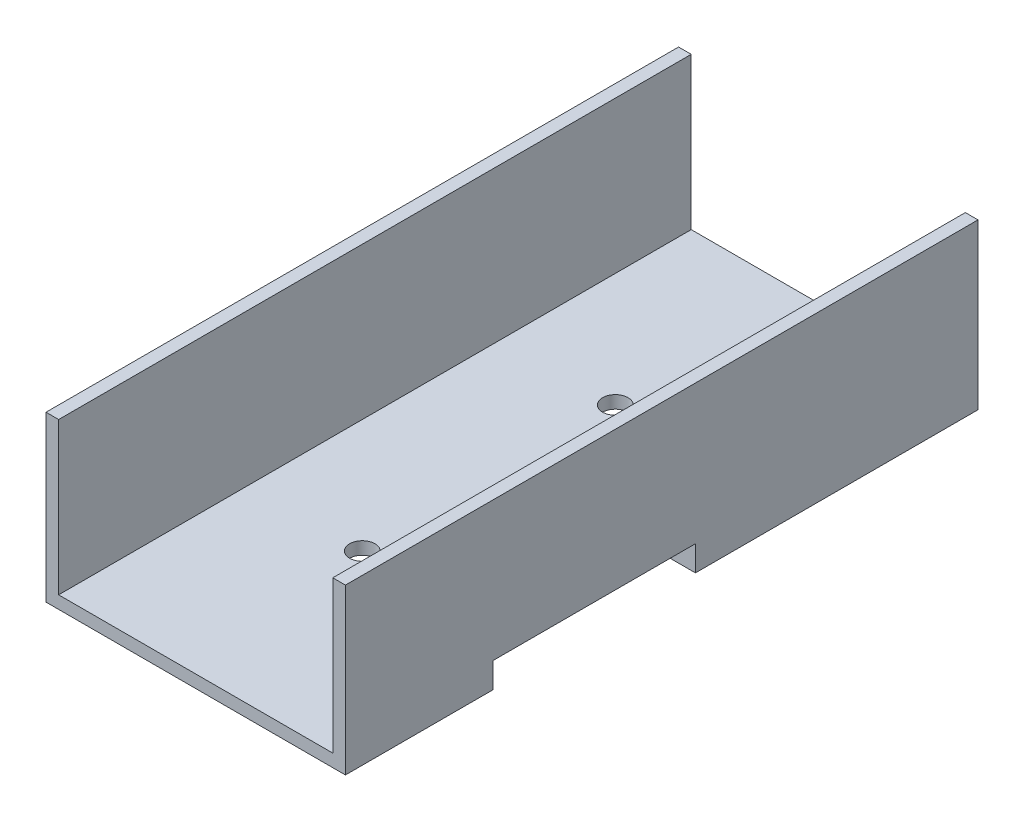
ISO-10303-21;
HEADER;
FILE_DESCRIPTION(('STEP AP214'),'2;1');
FILE_NAME('part.step','',(''),(''),'','','');
FILE_SCHEMA(('AUTOMOTIVE_DESIGN { 1 0 10303 214 1 1 1 1 }'));
ENDSEC;
DATA;
#1=APPLICATION_CONTEXT('core data for automotive mechanical design processes');
#2=APPLICATION_PROTOCOL_DEFINITION('international standard','automotive_design',2000,#1);
#3=PRODUCT_CONTEXT('',#1,'mechanical');
#4=PRODUCT('Part','Part','',(#3));
#5=PRODUCT_RELATED_PRODUCT_CATEGORY('part','',(#4));
#6=PRODUCT_DEFINITION_FORMATION('','',#4);
#7=PRODUCT_DEFINITION_CONTEXT('part definition',#1,'design');
#8=PRODUCT_DEFINITION('design','',#6,#7);
#9=PRODUCT_DEFINITION_SHAPE('','',#8);
#10=(LENGTH_UNIT() NAMED_UNIT(*) SI_UNIT(.MILLI.,.METRE.));
#11=(NAMED_UNIT(*) PLANE_ANGLE_UNIT() SI_UNIT($,.RADIAN.));
#12=(NAMED_UNIT(*) SI_UNIT($,.STERADIAN.) SOLID_ANGLE_UNIT());
#13=UNCERTAINTY_MEASURE_WITH_UNIT(LENGTH_MEASURE(1.E-05),#10,'distance_accuracy_value','');
#14=(GEOMETRIC_REPRESENTATION_CONTEXT(3) GLOBAL_UNCERTAINTY_ASSIGNED_CONTEXT((#13)) GLOBAL_UNIT_ASSIGNED_CONTEXT((#10,
#11,#12)) REPRESENTATION_CONTEXT('',''));
#15=CARTESIAN_POINT('',(0.,0.,0.));
#16=DIRECTION('',(0.,0.,1.));
#17=DIRECTION('',(1.,0.,0.));
#18=AXIS2_PLACEMENT_3D('',#15,#16,#17);
#19=CARTESIAN_POINT('',(17.75,0.,37.5));
#20=DIRECTION('',(-1.,0.,0.));
#21=DIRECTION('',(0.,0.,1.));
#22=AXIS2_PLACEMENT_3D('',#19,#20,#21);
#23=PLANE('',#22);
#24=DIRECTION('',(0.,0.,1.));
#25=VECTOR('',#24,1.);
#26=CARTESIAN_POINT('',(17.75,3.,20.));
#27=LINE('',#26,#25);
#28=CARTESIAN_POINT('',(17.75,3.,-4.));
#29=VERTEX_POINT('',#28);
#30=CARTESIAN_POINT('',(17.75,3.,20.));
#31=VERTEX_POINT('',#30);
#32=EDGE_CURVE('E150',#29,#31,#27,.T.);
#33=ORIENTED_EDGE('',*,*,#32,.F.);
#34=DIRECTION('',(0.,-1.,0.));
#35=VECTOR('',#34,1.);
#36=CARTESIAN_POINT('',(17.75,3.,-4.));
#37=LINE('',#36,#35);
#38=CARTESIAN_POINT('',(17.75,0.,-4.));
#39=VERTEX_POINT('',#38);
#40=EDGE_CURVE('E181',#29,#39,#37,.T.);
#41=ORIENTED_EDGE('',*,*,#40,.T.);
#42=DIRECTION('',(0.,0.,-1.));
#43=VECTOR('',#42,1.);
#44=CARTESIAN_POINT('',(17.75,0.,37.5));
#45=LINE('',#44,#43);
#46=CARTESIAN_POINT('',(17.75,0.,-37.5));
#47=VERTEX_POINT('',#46);
#48=EDGE_CURVE('E220',#39,#47,#45,.T.);
#49=ORIENTED_EDGE('',*,*,#48,.T.);
#50=DIRECTION('',(0.,1.,0.));
#51=VECTOR('',#50,1.);
#52=CARTESIAN_POINT('',(17.75,0.,-37.5));
#53=LINE('',#52,#51);
#54=CARTESIAN_POINT('',(17.75,19.5,-37.5));
#55=VERTEX_POINT('',#54);
#56=EDGE_CURVE('E197',#47,#55,#53,.T.);
#57=ORIENTED_EDGE('',*,*,#56,.T.);
#58=DIRECTION('',(0.,0.,-1.));
#59=VECTOR('',#58,1.);
#60=CARTESIAN_POINT('',(17.75,19.5,37.5));
#61=LINE('',#60,#59);
#62=CARTESIAN_POINT('',(17.75,19.5,37.5));
#63=VERTEX_POINT('',#62);
#64=EDGE_CURVE('E41',#63,#55,#61,.T.);
#65=ORIENTED_EDGE('',*,*,#64,.F.);
#66=DIRECTION('',(0.,1.,0.));
#67=VECTOR('',#66,1.);
#68=CARTESIAN_POINT('',(17.75,0.,37.5));
#69=LINE('',#68,#67);
#70=CARTESIAN_POINT('',(17.75,0.,37.5));
#71=VERTEX_POINT('',#70);
#72=EDGE_CURVE('E198',#71,#63,#69,.T.);
#73=ORIENTED_EDGE('',*,*,#72,.F.);
#74=CARTESIAN_POINT('',(17.75,0.,20.));
#75=VERTEX_POINT('',#74);
#76=EDGE_CURVE('E163',#71,#75,#45,.T.);
#77=ORIENTED_EDGE('',*,*,#76,.T.);
#78=DIRECTION('',(0.,-1.,0.));
#79=VECTOR('',#78,1.);
#80=CARTESIAN_POINT('',(17.75,3.,20.));
#81=LINE('',#80,#79);
#82=EDGE_CURVE('E54',#31,#75,#81,.T.);
#83=ORIENTED_EDGE('',*,*,#82,.F.);
#84=EDGE_LOOP('',(#33,#41,#49,#57,#65,#73,#77,#83));
#85=FACE_BOUND('',#84,.T.);
#86=ADVANCED_FACE('F34',(#85),#23,.F.);
#87=CARTESIAN_POINT('',(16.25,19.5,37.5));
#88=DIRECTION('',(0.,1.,0.));
#89=DIRECTION('',(0.,0.,1.));
#90=AXIS2_PLACEMENT_3D('',#87,#88,#89);
#91=PLANE('',#90);
#92=DIRECTION('',(1.,0.,0.));
#93=VECTOR('',#92,1.);
#94=CARTESIAN_POINT('',(16.25,19.5,-37.5));
#95=LINE('',#94,#93);
#96=CARTESIAN_POINT('',(16.25,19.5,-37.5));
#97=VERTEX_POINT('',#96);
#98=EDGE_CURVE('E223',#97,#55,#95,.T.);
#99=ORIENTED_EDGE('',*,*,#98,.F.);
#100=DIRECTION('',(0.,0.,-1.));
#101=VECTOR('',#100,1.);
#102=CARTESIAN_POINT('',(16.25,19.5,37.5));
#103=LINE('',#102,#101);
#104=CARTESIAN_POINT('',(16.25,19.5,37.5));
#105=VERTEX_POINT('',#104);
#106=EDGE_CURVE('E256',#105,#97,#103,.T.);
#107=ORIENTED_EDGE('',*,*,#106,.F.);
#108=DIRECTION('',(1.,0.,0.));
#109=VECTOR('',#108,1.);
#110=CARTESIAN_POINT('',(16.25,19.5,37.5));
#111=LINE('',#110,#109);
#112=EDGE_CURVE('E200',#105,#63,#111,.T.);
#113=ORIENTED_EDGE('',*,*,#112,.T.);
#114=ORIENTED_EDGE('',*,*,#64,.T.);
#115=EDGE_LOOP('',(#99,#107,#113,#114));
#116=FACE_BOUND('',#115,.T.);
#117=ADVANCED_FACE('F260',(#116),#91,.T.);
#118=CARTESIAN_POINT('',(16.25,0.,37.5));
#119=DIRECTION('',(-1.,0.,0.));
#120=DIRECTION('',(0.,0.,1.));
#121=AXIS2_PLACEMENT_3D('',#118,#119,#120);
#122=PLANE('',#121);
#123=DIRECTION('',(0.,-1.,0.));
#124=VECTOR('',#123,1.);
#125=CARTESIAN_POINT('',(16.25,0.,-4.));
#126=LINE('',#125,#124);
#127=CARTESIAN_POINT('',(16.25,3.,-4.));
#128=VERTEX_POINT('',#127);
#129=CARTESIAN_POINT('',(16.25,1.5,-4.));
#130=VERTEX_POINT('',#129);
#131=EDGE_CURVE('E195',#128,#130,#126,.T.);
#132=ORIENTED_EDGE('',*,*,#131,.F.);
#133=DIRECTION('',(0.,0.,1.));
#134=VECTOR('',#133,1.);
#135=CARTESIAN_POINT('',(16.25,3.,37.5));
#136=LINE('',#135,#134);
#137=CARTESIAN_POINT('',(16.25,3.,20.));
#138=VERTEX_POINT('',#137);
#139=EDGE_CURVE('E11',#128,#138,#136,.T.);
#140=ORIENTED_EDGE('',*,*,#139,.T.);
#141=DIRECTION('',(0.,1.,0.));
#142=VECTOR('',#141,1.);
#143=CARTESIAN_POINT('',(16.25,0.,20.));
#144=LINE('',#143,#142);
#145=CARTESIAN_POINT('',(16.25,1.5,20.));
#146=VERTEX_POINT('',#145);
#147=EDGE_CURVE('E147',#146,#138,#144,.T.);
#148=ORIENTED_EDGE('',*,*,#147,.F.);
#149=DIRECTION('',(0.,0.,-1.));
#150=VECTOR('',#149,1.);
#151=CARTESIAN_POINT('',(16.25,1.5,37.5));
#152=LINE('',#151,#150);
#153=CARTESIAN_POINT('',(16.25,1.5,37.5));
#154=VERTEX_POINT('',#153);
#155=EDGE_CURVE('E253',#154,#146,#152,.T.);
#156=ORIENTED_EDGE('',*,*,#155,.F.);
#157=DIRECTION('',(0.,1.,0.));
#158=VECTOR('',#157,1.);
#159=CARTESIAN_POINT('',(16.25,0.,37.5));
#160=LINE('',#159,#158);
#161=EDGE_CURVE('E204',#154,#105,#160,.T.);
#162=ORIENTED_EDGE('',*,*,#161,.T.);
#163=ORIENTED_EDGE('',*,*,#106,.T.);
#164=DIRECTION('',(0.,1.,0.));
#165=VECTOR('',#164,1.);
#166=CARTESIAN_POINT('',(16.25,0.,-37.5));
#167=LINE('',#166,#165);
#168=CARTESIAN_POINT('',(16.25,1.5,-37.5));
#169=VERTEX_POINT('',#168);
#170=EDGE_CURVE('E226',#169,#97,#167,.T.);
#171=ORIENTED_EDGE('',*,*,#170,.F.);
#172=EDGE_CURVE('E252',#130,#169,#152,.T.);
#173=ORIENTED_EDGE('',*,*,#172,.F.);
#174=EDGE_LOOP('',(#132,#140,#148,#156,#162,#163,#171,#173));
#175=FACE_BOUND('',#174,.T.);
#176=ADVANCED_FACE('F272',(#175),#122,.T.);
#177=CARTESIAN_POINT('',(-17.75,1.5,37.5));
#178=DIRECTION('',(0.,1.,0.));
#179=DIRECTION('',(0.,0.,1.));
#180=AXIS2_PLACEMENT_3D('',#177,#178,#179);
#181=PLANE('',#180);
#182=DIRECTION('',(-1.,0.,0.));
#183=VECTOR('',#182,1.);
#184=CARTESIAN_POINT('',(-17.75,1.5,-4.));
#185=LINE('',#184,#183);
#186=CARTESIAN_POINT('',(11.75,1.5,-4.));
#187=VERTEX_POINT('',#186);
#188=EDGE_CURVE('E193',#130,#187,#185,.T.);
#189=ORIENTED_EDGE('',*,*,#188,.F.);
#190=ORIENTED_EDGE('',*,*,#172,.T.);
#191=DIRECTION('',(1.,0.,0.));
#192=VECTOR('',#191,1.);
#193=CARTESIAN_POINT('',(-17.75,1.5,-37.5));
#194=LINE('',#193,#192);
#195=CARTESIAN_POINT('',(-16.25,1.5,-37.5));
#196=VERTEX_POINT('',#195);
#197=EDGE_CURVE('E229',#196,#169,#194,.T.);
#198=ORIENTED_EDGE('',*,*,#197,.F.);
#199=DIRECTION('',(0.,0.,-1.));
#200=VECTOR('',#199,1.);
#201=CARTESIAN_POINT('',(-16.25,1.5,37.5));
#202=LINE('',#201,#200);
#203=CARTESIAN_POINT('',(-16.25,1.5,37.5));
#204=VERTEX_POINT('',#203);
#205=EDGE_CURVE('E250',#204,#196,#202,.T.);
#206=ORIENTED_EDGE('',*,*,#205,.F.);
#207=DIRECTION('',(1.,0.,0.));
#208=VECTOR('',#207,1.);
#209=CARTESIAN_POINT('',(-17.75,1.5,37.5));
#210=LINE('',#209,#208);
#211=EDGE_CURVE('E207',#204,#154,#210,.T.);
#212=ORIENTED_EDGE('',*,*,#211,.T.);
#213=ORIENTED_EDGE('',*,*,#155,.T.);
#214=DIRECTION('',(1.,0.,0.));
#215=VECTOR('',#214,1.);
#216=CARTESIAN_POINT('',(-17.75,1.5,20.));
#217=LINE('',#216,#215);
#218=CARTESIAN_POINT('',(11.75,1.5,20.));
#219=VERTEX_POINT('',#218);
#220=EDGE_CURVE('E184',#219,#146,#217,.T.);
#221=ORIENTED_EDGE('',*,*,#220,.F.);
#222=CARTESIAN_POINT('',(11.75,1.5,16.));
#223=DIRECTION('',(0.,1.,0.));
#224=DIRECTION('',(0.,0.,1.));
#225=AXIS2_PLACEMENT_3D('',#222,#223,#224);
#226=CIRCLE('',#225,4.);
#227=CARTESIAN_POINT('',(7.75,1.5,16.));
#228=VERTEX_POINT('',#227);
#229=EDGE_CURVE('E187',#228,#219,#226,.T.);
#230=ORIENTED_EDGE('',*,*,#229,.F.);
#231=DIRECTION('',(0.,0.,1.));
#232=VECTOR('',#231,1.);
#233=CARTESIAN_POINT('',(7.74999999999999,1.5,37.5));
#234=LINE('',#233,#232);
#235=CARTESIAN_POINT('',(7.75,1.5,0.));
#236=VERTEX_POINT('',#235);
#237=EDGE_CURVE('E189',#236,#228,#234,.T.);
#238=ORIENTED_EDGE('',*,*,#237,.F.);
#239=CARTESIAN_POINT('',(11.75,1.5,0.));
#240=DIRECTION('',(0.,1.,0.));
#241=DIRECTION('',(0.,0.,1.));
#242=AXIS2_PLACEMENT_3D('',#239,#240,#241);
#243=CIRCLE('',#242,4.);
#244=EDGE_CURVE('E191',#187,#236,#243,.T.);
#245=ORIENTED_EDGE('',*,*,#244,.F.);
#246=EDGE_LOOP('',(#189,#190,#198,#206,#212,#213,#221,#230,#238,#245));
#247=FACE_BOUND('',#246,.T.);
#248=CARTESIAN_POINT('',(-2.75,1.5,-15.));
#249=DIRECTION('',(0.,1.,0.));
#250=DIRECTION('',(0.,0.,1.));
#251=AXIS2_PLACEMENT_3D('',#248,#249,#250);
#252=CIRCLE('',#251,1.5);
#253=CARTESIAN_POINT('',(-2.75,1.5,-13.5));
#254=VERTEX_POINT('',#253);
#255=EDGE_CURVE('E180',#254,#254,#252,.T.);
#256=ORIENTED_EDGE('',*,*,#255,.F.);
#257=EDGE_LOOP('',(#256));
#258=FACE_BOUND('',#257,.T.);
#259=CARTESIAN_POINT('',(-2.75,1.5,15.));
#260=DIRECTION('',(0.,1.,0.));
#261=DIRECTION('',(0.,0.,1.));
#262=AXIS2_PLACEMENT_3D('',#259,#260,#261);
#263=CIRCLE('',#262,1.5);
#264=CARTESIAN_POINT('',(-2.75,1.5,16.5));
#265=VERTEX_POINT('',#264);
#266=EDGE_CURVE('E177',#265,#265,#263,.T.);
#267=ORIENTED_EDGE('',*,*,#266,.F.);
#268=EDGE_LOOP('',(#267));
#269=FACE_BOUND('',#268,.T.);
#270=ADVANCED_FACE('F317',(#247,#258,#269),#181,.T.);
#271=CARTESIAN_POINT('',(-16.25,19.5,37.5));
#272=DIRECTION('',(1.,0.,0.));
#273=DIRECTION('',(0.,0.,-1.));
#274=AXIS2_PLACEMENT_3D('',#271,#272,#273);
#275=PLANE('',#274);
#276=DIRECTION('',(0.,1.,0.));
#277=VECTOR('',#276,1.);
#278=CARTESIAN_POINT('',(-16.25,19.5,-37.5));
#279=LINE('',#278,#277);
#280=CARTESIAN_POINT('',(-16.25,19.5,-37.5));
#281=VERTEX_POINT('',#280);
#282=EDGE_CURVE('E232',#281,#196,#279,.F.);
#283=ORIENTED_EDGE('',*,*,#282,.F.);
#284=DIRECTION('',(0.,0.,-1.));
#285=VECTOR('',#284,1.);
#286=CARTESIAN_POINT('',(-16.25,19.5,37.5));
#287=LINE('',#286,#285);
#288=CARTESIAN_POINT('',(-16.25,19.5,37.5));
#289=VERTEX_POINT('',#288);
#290=EDGE_CURVE('E248',#289,#281,#287,.T.);
#291=ORIENTED_EDGE('',*,*,#290,.F.);
#292=DIRECTION('',(0.,1.,0.));
#293=VECTOR('',#292,1.);
#294=CARTESIAN_POINT('',(-16.25,19.5,37.5));
#295=LINE('',#294,#293);
#296=EDGE_CURVE('E210',#289,#204,#295,.F.);
#297=ORIENTED_EDGE('',*,*,#296,.T.);
#298=ORIENTED_EDGE('',*,*,#205,.T.);
#299=EDGE_LOOP('',(#283,#291,#297,#298));
#300=FACE_BOUND('',#299,.T.);
#301=ADVANCED_FACE('F330',(#300),#275,.T.);
#302=CARTESIAN_POINT('',(-17.75,19.5,37.5));
#303=DIRECTION('',(0.,1.,0.));
#304=DIRECTION('',(0.,0.,1.));
#305=AXIS2_PLACEMENT_3D('',#302,#303,#304);
#306=PLANE('',#305);
#307=DIRECTION('',(1.,0.,0.));
#308=VECTOR('',#307,1.);
#309=CARTESIAN_POINT('',(-17.75,19.5,-37.5));
#310=LINE('',#309,#308);
#311=CARTESIAN_POINT('',(-17.75,19.5,-37.5));
#312=VERTEX_POINT('',#311);
#313=EDGE_CURVE('E235',#312,#281,#310,.T.);
#314=ORIENTED_EDGE('',*,*,#313,.F.);
#315=DIRECTION('',(0.,0.,-1.));
#316=VECTOR('',#315,1.);
#317=CARTESIAN_POINT('',(-17.75,19.5,37.5));
#318=LINE('',#317,#316);
#319=CARTESIAN_POINT('',(-17.75,19.5,37.5));
#320=VERTEX_POINT('',#319);
#321=EDGE_CURVE('E246',#320,#312,#318,.T.);
#322=ORIENTED_EDGE('',*,*,#321,.F.);
#323=DIRECTION('',(1.,0.,0.));
#324=VECTOR('',#323,1.);
#325=CARTESIAN_POINT('',(-17.75,19.5,37.5));
#326=LINE('',#325,#324);
#327=EDGE_CURVE('E213',#320,#289,#326,.T.);
#328=ORIENTED_EDGE('',*,*,#327,.T.);
#329=ORIENTED_EDGE('',*,*,#290,.T.);
#330=EDGE_LOOP('',(#314,#322,#328,#329));
#331=FACE_BOUND('',#330,.T.);
#332=ADVANCED_FACE('F326',(#331),#306,.T.);
#333=CARTESIAN_POINT('',(-17.75,19.5,37.5));
#334=DIRECTION('',(1.,0.,0.));
#335=DIRECTION('',(0.,0.,-1.));
#336=AXIS2_PLACEMENT_3D('',#333,#334,#335);
#337=PLANE('',#336);
#338=DIRECTION('',(0.,-1.,0.));
#339=VECTOR('',#338,1.);
#340=CARTESIAN_POINT('',(-17.75,19.5,-37.5));
#341=LINE('',#340,#339);
#342=CARTESIAN_POINT('',(-17.75,0.,-37.5));
#343=VERTEX_POINT('',#342);
#344=EDGE_CURVE('E238',#312,#343,#341,.T.);
#345=ORIENTED_EDGE('',*,*,#344,.T.);
#346=DIRECTION('',(0.,0.,-1.));
#347=VECTOR('',#346,1.);
#348=CARTESIAN_POINT('',(-17.75,0.,37.5));
#349=LINE('',#348,#347);
#350=CARTESIAN_POINT('',(-17.75,0.,37.5));
#351=VERTEX_POINT('',#350);
#352=EDGE_CURVE('E243',#351,#343,#349,.T.);
#353=ORIENTED_EDGE('',*,*,#352,.F.);
#354=DIRECTION('',(0.,-1.,0.));
#355=VECTOR('',#354,1.);
#356=CARTESIAN_POINT('',(-17.75,19.5,37.5));
#357=LINE('',#356,#355);
#358=EDGE_CURVE('E216',#320,#351,#357,.T.);
#359=ORIENTED_EDGE('',*,*,#358,.F.);
#360=ORIENTED_EDGE('',*,*,#321,.T.);
#361=EDGE_LOOP('',(#345,#353,#359,#360));
#362=FACE_BOUND('',#361,.T.);
#363=ADVANCED_FACE('F337',(#362),#337,.F.);
#364=CARTESIAN_POINT('',(-17.75,0.,37.5));
#365=DIRECTION('',(0.,1.,0.));
#366=DIRECTION('',(0.,0.,1.));
#367=AXIS2_PLACEMENT_3D('',#364,#365,#366);
#368=PLANE('',#367);
#369=CARTESIAN_POINT('',(-2.75,0.,-15.));
#370=DIRECTION('',(0.,-1.,0.));
#371=DIRECTION('',(0.,0.,1.));
#372=AXIS2_PLACEMENT_3D('',#369,#370,#371);
#373=CIRCLE('',#372,1.5);
#374=CARTESIAN_POINT('',(-2.75,0.,-13.5));
#375=VERTEX_POINT('',#374);
#376=EDGE_CURVE('E170',#375,#375,#373,.T.);
#377=ORIENTED_EDGE('',*,*,#376,.F.);
#378=EDGE_LOOP('',(#377));
#379=FACE_BOUND('',#378,.T.);
#380=CARTESIAN_POINT('',(-2.75,0.,15.));
#381=DIRECTION('',(0.,-1.,0.));
#382=DIRECTION('',(0.,0.,-1.));
#383=AXIS2_PLACEMENT_3D('',#380,#381,#382);
#384=CIRCLE('',#383,1.5);
#385=CARTESIAN_POINT('',(-2.75,0.,13.5));
#386=VERTEX_POINT('',#385);
#387=EDGE_CURVE('E174',#386,#386,#384,.T.);
#388=ORIENTED_EDGE('',*,*,#387,.F.);
#389=EDGE_LOOP('',(#388));
#390=FACE_BOUND('',#389,.T.);
#391=ORIENTED_EDGE('',*,*,#48,.F.);
#392=DIRECTION('',(1.,0.,0.));
#393=VECTOR('',#392,1.);
#394=CARTESIAN_POINT('',(11.75,0.,-4.));
#395=LINE('',#394,#393);
#396=CARTESIAN_POINT('',(11.75,0.,-4.));
#397=VERTEX_POINT('',#396);
#398=EDGE_CURVE('E158',#397,#39,#395,.T.);
#399=ORIENTED_EDGE('',*,*,#398,.F.);
#400=CARTESIAN_POINT('',(11.75,0.,0.));
#401=DIRECTION('',(0.,-1.,0.));
#402=DIRECTION('',(0.,0.,-1.));
#403=AXIS2_PLACEMENT_3D('',#400,#401,#402);
#404=CIRCLE('',#403,4.);
#405=CARTESIAN_POINT('',(7.75,0.,0.));
#406=VERTEX_POINT('',#405);
#407=EDGE_CURVE('E293',#406,#397,#404,.T.);
#408=ORIENTED_EDGE('',*,*,#407,.F.);
#409=DIRECTION('',(0.,0.,-1.));
#410=VECTOR('',#409,1.);
#411=CARTESIAN_POINT('',(7.75,0.,16.));
#412=LINE('',#411,#410);
#413=CARTESIAN_POINT('',(7.75,0.,16.));
#414=VERTEX_POINT('',#413);
#415=EDGE_CURVE('E288',#414,#406,#412,.T.);
#416=ORIENTED_EDGE('',*,*,#415,.F.);
#417=CARTESIAN_POINT('',(11.75,0.,16.));
#418=DIRECTION('',(0.,-1.,0.));
#419=DIRECTION('',(0.,0.,-1.));
#420=AXIS2_PLACEMENT_3D('',#417,#418,#419);
#421=CIRCLE('',#420,4.);
#422=CARTESIAN_POINT('',(11.75,0.,20.));
#423=VERTEX_POINT('',#422);
#424=EDGE_CURVE('E286',#423,#414,#421,.T.);
#425=ORIENTED_EDGE('',*,*,#424,.F.);
#426=DIRECTION('',(-1.,0.,0.));
#427=VECTOR('',#426,1.);
#428=CARTESIAN_POINT('',(11.75,0.,20.));
#429=LINE('',#428,#427);
#430=EDGE_CURVE('E173',#75,#423,#429,.T.);
#431=ORIENTED_EDGE('',*,*,#430,.F.);
#432=ORIENTED_EDGE('',*,*,#76,.F.);
#433=DIRECTION('',(1.,0.,0.));
#434=VECTOR('',#433,1.);
#435=CARTESIAN_POINT('',(-17.75,0.,37.5));
#436=LINE('',#435,#434);
#437=EDGE_CURVE('E218',#351,#71,#436,.T.);
#438=ORIENTED_EDGE('',*,*,#437,.F.);
#439=ORIENTED_EDGE('',*,*,#352,.T.);
#440=DIRECTION('',(1.,0.,0.));
#441=VECTOR('',#440,1.);
#442=CARTESIAN_POINT('',(-17.75,0.,-37.5));
#443=LINE('',#442,#441);
#444=EDGE_CURVE('E201',#343,#47,#443,.T.);
#445=ORIENTED_EDGE('',*,*,#444,.T.);
#446=EDGE_LOOP('',(#391,#399,#408,#416,#425,#431,#432,#438,#439,#445));
#447=FACE_BOUND('',#446,.T.);
#448=ADVANCED_FACE('F282',(#379,#390,#447),#368,.F.);
#449=CARTESIAN_POINT('',(0.,0.,37.5));
#450=DIRECTION('',(0.,0.,-1.));
#451=DIRECTION('',(-1.,0.,0.));
#452=AXIS2_PLACEMENT_3D('',#449,#450,#451);
#453=PLANE('',#452);
#454=ORIENTED_EDGE('',*,*,#72,.T.);
#455=ORIENTED_EDGE('',*,*,#112,.F.);
#456=ORIENTED_EDGE('',*,*,#161,.F.);
#457=ORIENTED_EDGE('',*,*,#211,.F.);
#458=ORIENTED_EDGE('',*,*,#296,.F.);
#459=ORIENTED_EDGE('',*,*,#327,.F.);
#460=ORIENTED_EDGE('',*,*,#358,.T.);
#461=ORIENTED_EDGE('',*,*,#437,.T.);
#462=EDGE_LOOP('',(#454,#455,#456,#457,#458,#459,#460,#461));
#463=FACE_BOUND('',#462,.T.);
#464=ADVANCED_FACE('F275',(#463),#453,.F.);
#465=CARTESIAN_POINT('',(0.,0.,-37.5));
#466=DIRECTION('',(0.,0.,-1.));
#467=DIRECTION('',(-1.,0.,0.));
#468=AXIS2_PLACEMENT_3D('',#465,#466,#467);
#469=PLANE('',#468);
#470=ORIENTED_EDGE('',*,*,#56,.F.);
#471=ORIENTED_EDGE('',*,*,#444,.F.);
#472=ORIENTED_EDGE('',*,*,#344,.F.);
#473=ORIENTED_EDGE('',*,*,#313,.T.);
#474=ORIENTED_EDGE('',*,*,#282,.T.);
#475=ORIENTED_EDGE('',*,*,#197,.T.);
#476=ORIENTED_EDGE('',*,*,#170,.T.);
#477=ORIENTED_EDGE('',*,*,#98,.T.);
#478=EDGE_LOOP('',(#470,#471,#472,#473,#474,#475,#476,#477));
#479=FACE_BOUND('',#478,.T.);
#480=ADVANCED_FACE('F266',(#479),#469,.T.);
#481=CARTESIAN_POINT('',(-2.75,3.,15.));
#482=DIRECTION('',(0.,-1.,0.));
#483=DIRECTION('',(0.,0.,-1.));
#484=AXIS2_PLACEMENT_3D('',#481,#482,#483);
#485=CYLINDRICAL_SURFACE('',#484,1.5);
#486=ORIENTED_EDGE('',*,*,#266,.T.);
#487=EDGE_LOOP('',(#486));
#488=FACE_BOUND('',#487,.T.);
#489=ORIENTED_EDGE('',*,*,#387,.T.);
#490=EDGE_LOOP('',(#489));
#491=FACE_BOUND('',#490,.T.);
#492=ADVANCED_FACE('F373',(#488,#491),#485,.F.);
#493=CARTESIAN_POINT('',(-2.75,3.,-15.));
#494=DIRECTION('',(0.,-1.,0.));
#495=DIRECTION('',(0.,0.,-1.));
#496=AXIS2_PLACEMENT_3D('',#493,#494,#495);
#497=CYLINDRICAL_SURFACE('',#496,1.5);
#498=ORIENTED_EDGE('',*,*,#255,.T.);
#499=EDGE_LOOP('',(#498));
#500=FACE_BOUND('',#499,.T.);
#501=ORIENTED_EDGE('',*,*,#376,.T.);
#502=EDGE_LOOP('',(#501));
#503=FACE_BOUND('',#502,.T.);
#504=ADVANCED_FACE('F378',(#500,#503),#497,.F.);
#505=CARTESIAN_POINT('',(11.75,3.,-4.));
#506=DIRECTION('',(0.,0.,-1.));
#507=DIRECTION('',(-1.,0.,0.));
#508=AXIS2_PLACEMENT_3D('',#505,#506,#507);
#509=PLANE('',#508);
#510=ORIENTED_EDGE('',*,*,#131,.T.);
#511=ORIENTED_EDGE('',*,*,#188,.T.);
#512=DIRECTION('',(0.,-1.,0.));
#513=VECTOR('',#512,1.);
#514=CARTESIAN_POINT('',(11.75,3.,-4.));
#515=LINE('',#514,#513);
#516=EDGE_CURVE('E298',#187,#397,#515,.T.);
#517=ORIENTED_EDGE('',*,*,#516,.T.);
#518=ORIENTED_EDGE('',*,*,#398,.T.);
#519=ORIENTED_EDGE('',*,*,#40,.F.);
#520=DIRECTION('',(1.,0.,0.));
#521=VECTOR('',#520,1.);
#522=CARTESIAN_POINT('',(11.75,3.,-4.));
#523=LINE('',#522,#521);
#524=EDGE_CURVE('E149',#128,#29,#523,.T.);
#525=ORIENTED_EDGE('',*,*,#524,.F.);
#526=EDGE_LOOP('',(#510,#511,#517,#518,#519,#525));
#527=FACE_BOUND('',#526,.T.);
#528=ADVANCED_FACE('F321',(#527),#509,.F.);
#529=CARTESIAN_POINT('',(11.75,3.,0.));
#530=DIRECTION('',(0.,-1.,0.));
#531=DIRECTION('',(0.,0.,-1.));
#532=AXIS2_PLACEMENT_3D('',#529,#530,#531);
#533=CYLINDRICAL_SURFACE('',#532,4.);
#534=ORIENTED_EDGE('',*,*,#244,.T.);
#535=DIRECTION('',(0.,-1.,0.));
#536=VECTOR('',#535,1.);
#537=CARTESIAN_POINT('',(7.75,3.,0.));
#538=LINE('',#537,#536);
#539=EDGE_CURVE('E300',#236,#406,#538,.T.);
#540=ORIENTED_EDGE('',*,*,#539,.T.);
#541=ORIENTED_EDGE('',*,*,#407,.T.);
#542=ORIENTED_EDGE('',*,*,#516,.F.);
#543=EDGE_LOOP('',(#534,#540,#541,#542));
#544=FACE_BOUND('',#543,.T.);
#545=ADVANCED_FACE('F313',(#544),#533,.F.);
#546=CARTESIAN_POINT('',(7.75,3.,16.));
#547=DIRECTION('',(-1.,0.,0.));
#548=DIRECTION('',(0.,0.,1.));
#549=AXIS2_PLACEMENT_3D('',#546,#547,#548);
#550=PLANE('',#549);
#551=ORIENTED_EDGE('',*,*,#237,.T.);
#552=DIRECTION('',(0.,-1.,0.));
#553=VECTOR('',#552,1.);
#554=CARTESIAN_POINT('',(7.75,3.,16.));
#555=LINE('',#554,#553);
#556=EDGE_CURVE('E165',#228,#414,#555,.T.);
#557=ORIENTED_EDGE('',*,*,#556,.T.);
#558=ORIENTED_EDGE('',*,*,#415,.T.);
#559=ORIENTED_EDGE('',*,*,#539,.F.);
#560=EDGE_LOOP('',(#551,#557,#558,#559));
#561=FACE_BOUND('',#560,.T.);
#562=ADVANCED_FACE('F303',(#561),#550,.F.);
#563=CARTESIAN_POINT('',(11.75,3.,16.));
#564=DIRECTION('',(0.,-1.,0.));
#565=DIRECTION('',(0.,0.,-1.));
#566=AXIS2_PLACEMENT_3D('',#563,#564,#565);
#567=CYLINDRICAL_SURFACE('',#566,4.);
#568=ORIENTED_EDGE('',*,*,#229,.T.);
#569=DIRECTION('',(0.,-1.,0.));
#570=VECTOR('',#569,1.);
#571=CARTESIAN_POINT('',(11.75,3.,20.));
#572=LINE('',#571,#570);
#573=EDGE_CURVE('E48',#219,#423,#572,.T.);
#574=ORIENTED_EDGE('',*,*,#573,.T.);
#575=ORIENTED_EDGE('',*,*,#424,.T.);
#576=ORIENTED_EDGE('',*,*,#556,.F.);
#577=EDGE_LOOP('',(#568,#574,#575,#576));
#578=FACE_BOUND('',#577,.T.);
#579=ADVANCED_FACE('F309',(#578),#567,.F.);
#580=CARTESIAN_POINT('',(11.75,3.,20.));
#581=DIRECTION('',(0.,0.,1.));
#582=DIRECTION('',(1.,0.,0.));
#583=AXIS2_PLACEMENT_3D('',#580,#581,#582);
#584=PLANE('',#583);
#585=ORIENTED_EDGE('',*,*,#147,.T.);
#586=DIRECTION('',(-1.,0.,0.));
#587=VECTOR('',#586,1.);
#588=CARTESIAN_POINT('',(11.75,3.,20.));
#589=LINE('',#588,#587);
#590=EDGE_CURVE('E143',#31,#138,#589,.T.);
#591=ORIENTED_EDGE('',*,*,#590,.F.);
#592=ORIENTED_EDGE('',*,*,#82,.T.);
#593=ORIENTED_EDGE('',*,*,#430,.T.);
#594=ORIENTED_EDGE('',*,*,#573,.F.);
#595=ORIENTED_EDGE('',*,*,#220,.T.);
#596=EDGE_LOOP('',(#585,#591,#592,#593,#594,#595));
#597=FACE_BOUND('',#596,.T.);
#598=ADVANCED_FACE('F145',(#597),#584,.F.);
#599=CARTESIAN_POINT('',(11.75,3.,0.));
#600=DIRECTION('',(0.,-1.,0.));
#601=DIRECTION('',(0.,0.,-1.));
#602=AXIS2_PLACEMENT_3D('',#599,#600,#601);
#603=PLANE('',#602);
#604=ORIENTED_EDGE('',*,*,#524,.T.);
#605=ORIENTED_EDGE('',*,*,#32,.T.);
#606=ORIENTED_EDGE('',*,*,#590,.T.);
#607=ORIENTED_EDGE('',*,*,#139,.F.);
#608=EDGE_LOOP('',(#604,#605,#606,#607));
#609=FACE_BOUND('',#608,.T.);
#610=ADVANCED_FACE('F153',(#609),#603,.T.);
#611=CLOSED_SHELL('',(#86,#117,#176,#270,#301,#332,#363,#448,#464,#480,#492,#504,#528,#545,#562,
#579,#598,#610));
#612=MANIFOLD_SOLID_BREP('B2',#611);
#613=ADVANCED_BREP_SHAPE_REPRESENTATION('',(#18,#612),#14);
#614=SHAPE_DEFINITION_REPRESENTATION(#9,#613);
ENDSEC;
END-ISO-10303-21;
